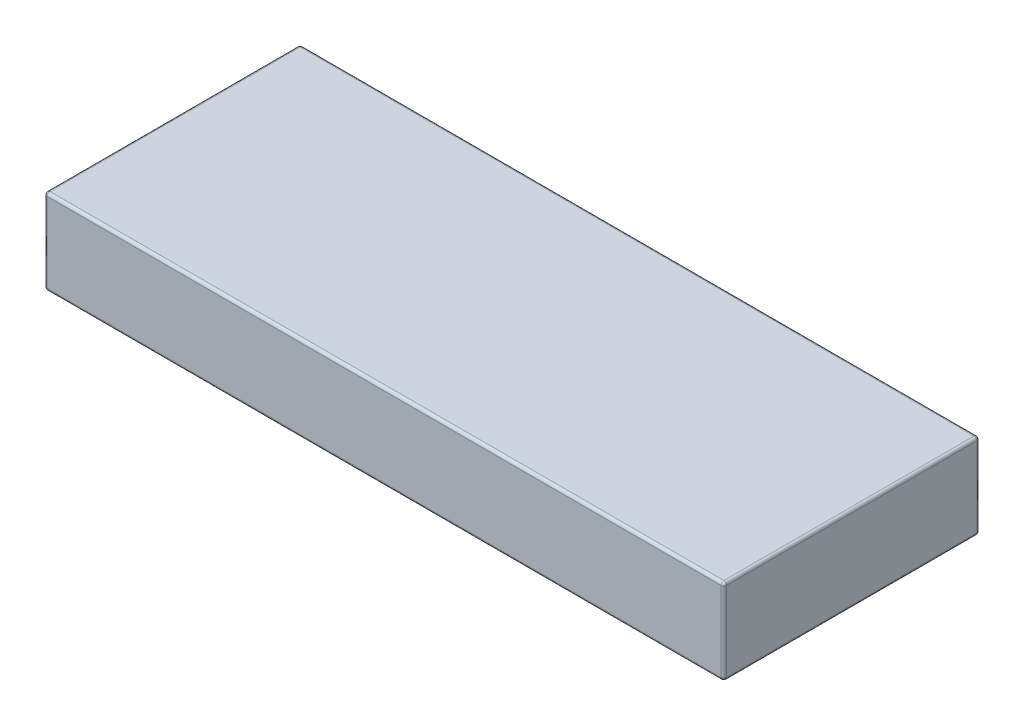
ISO-10303-21;
HEADER;
FILE_DESCRIPTION(('STEP AP214'),'2;1');
FILE_NAME('part.step','',(''),(''),'','','');
FILE_SCHEMA(('AUTOMOTIVE_DESIGN { 1 0 10303 214 1 1 1 1 }'));
ENDSEC;
DATA;
#1=APPLICATION_CONTEXT('core data for automotive mechanical design processes');
#2=APPLICATION_PROTOCOL_DEFINITION('international standard','automotive_design',2000,#1);
#3=PRODUCT_CONTEXT('',#1,'mechanical');
#4=PRODUCT('Part','Part','',(#3));
#5=PRODUCT_RELATED_PRODUCT_CATEGORY('part','',(#4));
#6=PRODUCT_DEFINITION_FORMATION('','',#4);
#7=PRODUCT_DEFINITION_CONTEXT('part definition',#1,'design');
#8=PRODUCT_DEFINITION('design','',#6,#7);
#9=PRODUCT_DEFINITION_SHAPE('','',#8);
#10=(LENGTH_UNIT() NAMED_UNIT(*) SI_UNIT(.MILLI.,.METRE.));
#11=(NAMED_UNIT(*) PLANE_ANGLE_UNIT() SI_UNIT($,.RADIAN.));
#12=(NAMED_UNIT(*) SI_UNIT($,.STERADIAN.) SOLID_ANGLE_UNIT());
#13=UNCERTAINTY_MEASURE_WITH_UNIT(LENGTH_MEASURE(1.E-05),#10,'distance_accuracy_value','');
#14=(GEOMETRIC_REPRESENTATION_CONTEXT(3) GLOBAL_UNCERTAINTY_ASSIGNED_CONTEXT((#13)) GLOBAL_UNIT_ASSIGNED_CONTEXT((#10,
#11,#12)) REPRESENTATION_CONTEXT('',''));
#15=CARTESIAN_POINT('',(0.,0.,0.));
#16=DIRECTION('',(0.,0.,1.));
#17=DIRECTION('',(1.,0.,0.));
#18=AXIS2_PLACEMENT_3D('',#15,#16,#17);
#19=CARTESIAN_POINT('',(0.,3.81,0.));
#20=DIRECTION('',(1.,0.,0.));
#21=DIRECTION('',(0.,0.,-1.));
#22=AXIS2_PLACEMENT_3D('',#19,#20,#21);
#23=PLANE('',#22);
#24=DIRECTION('',(0.,0.,1.));
#25=VECTOR('',#24,1.);
#26=CARTESIAN_POINT('',(0.,3.683,0.));
#27=LINE('',#26,#25);
#28=CARTESIAN_POINT('',(0.,3.683,-0.127));
#29=VERTEX_POINT('',#28);
#30=CARTESIAN_POINT('',(0.,3.683,-11.303));
#31=VERTEX_POINT('',#30);
#32=EDGE_CURVE('E153',#29,#31,#27,.F.);
#33=ORIENTED_EDGE('',*,*,#32,.T.);
#34=DIRECTION('',(0.,-1.,0.));
#35=VECTOR('',#34,1.);
#36=CARTESIAN_POINT('',(0.,3.81,-11.303));
#37=LINE('',#36,#35);
#38=CARTESIAN_POINT('',(0.,0.127,-11.303));
#39=VERTEX_POINT('',#38);
#40=EDGE_CURVE('E156',#31,#39,#37,.T.);
#41=ORIENTED_EDGE('',*,*,#40,.T.);
#42=DIRECTION('',(0.,0.,1.));
#43=VECTOR('',#42,1.);
#44=CARTESIAN_POINT('',(0.,0.127,0.));
#45=LINE('',#44,#43);
#46=CARTESIAN_POINT('',(0.,0.127,-0.127));
#47=VERTEX_POINT('',#46);
#48=EDGE_CURVE('E130',#39,#47,#45,.T.);
#49=ORIENTED_EDGE('',*,*,#48,.T.);
#50=DIRECTION('',(0.,-1.,0.));
#51=VECTOR('',#50,1.);
#52=CARTESIAN_POINT('',(0.,3.81,-0.127));
#53=LINE('',#52,#51);
#54=EDGE_CURVE('E148',#47,#29,#53,.F.);
#55=ORIENTED_EDGE('',*,*,#54,.T.);
#56=EDGE_LOOP('',(#33,#41,#49,#55));
#57=FACE_BOUND('',#56,.T.);
#58=ADVANCED_FACE('F33',(#57),#23,.F.);
#59=CARTESIAN_POINT('',(0.,3.81,0.));
#60=DIRECTION('',(0.,0.,-1.));
#61=DIRECTION('',(-1.,0.,0.));
#62=AXIS2_PLACEMENT_3D('',#59,#60,#61);
#63=PLANE('',#62);
#64=DIRECTION('',(1.,0.,0.));
#65=VECTOR('',#64,1.);
#66=CARTESIAN_POINT('',(0.,3.683,0.));
#67=LINE('',#66,#65);
#68=CARTESIAN_POINT('',(30.226,3.683,0.));
#69=VERTEX_POINT('',#68);
#70=CARTESIAN_POINT('',(0.127,3.683,0.));
#71=VERTEX_POINT('',#70);
#72=EDGE_CURVE('E171',#69,#71,#67,.F.);
#73=ORIENTED_EDGE('',*,*,#72,.T.);
#74=DIRECTION('',(0.,-1.,0.));
#75=VECTOR('',#74,1.);
#76=CARTESIAN_POINT('',(0.127,3.81,0.));
#77=LINE('',#76,#75);
#78=CARTESIAN_POINT('',(0.127,0.127,0.));
#79=VERTEX_POINT('',#78);
#80=EDGE_CURVE('E176',#71,#79,#77,.T.);
#81=ORIENTED_EDGE('',*,*,#80,.T.);
#82=DIRECTION('',(1.,0.,0.));
#83=VECTOR('',#82,1.);
#84=CARTESIAN_POINT('',(30.353,0.127,0.));
#85=LINE('',#84,#83);
#86=CARTESIAN_POINT('',(30.226,0.127,0.));
#87=VERTEX_POINT('',#86);
#88=EDGE_CURVE('E173',#79,#87,#85,.T.);
#89=ORIENTED_EDGE('',*,*,#88,.T.);
#90=DIRECTION('',(0.,-1.,0.));
#91=VECTOR('',#90,1.);
#92=CARTESIAN_POINT('',(30.226,3.81,0.));
#93=LINE('',#92,#91);
#94=EDGE_CURVE('E169',#87,#69,#93,.F.);
#95=ORIENTED_EDGE('',*,*,#94,.T.);
#96=EDGE_LOOP('',(#73,#81,#89,#95));
#97=FACE_BOUND('',#96,.T.);
#98=ADVANCED_FACE('F323',(#97),#63,.F.);
#99=CARTESIAN_POINT('',(30.353,3.81,0.));
#100=DIRECTION('',(-1.,0.,0.));
#101=DIRECTION('',(0.,0.,1.));
#102=AXIS2_PLACEMENT_3D('',#99,#100,#101);
#103=PLANE('',#102);
#104=DIRECTION('',(0.,0.,-1.));
#105=VECTOR('',#104,1.);
#106=CARTESIAN_POINT('',(30.353,0.127,-11.43));
#107=LINE('',#106,#105);
#108=CARTESIAN_POINT('',(30.353,0.127,-0.127));
#109=VERTEX_POINT('',#108);
#110=CARTESIAN_POINT('',(30.353,0.127,-11.303));
#111=VERTEX_POINT('',#110);
#112=EDGE_CURVE('E182',#109,#111,#107,.T.);
#113=ORIENTED_EDGE('',*,*,#112,.T.);
#114=DIRECTION('',(0.,-1.,0.));
#115=VECTOR('',#114,1.);
#116=CARTESIAN_POINT('',(30.353,3.81,-11.303));
#117=LINE('',#116,#115);
#118=CARTESIAN_POINT('',(30.353,3.683,-11.303));
#119=VERTEX_POINT('',#118);
#120=EDGE_CURVE('E185',#111,#119,#117,.F.);
#121=ORIENTED_EDGE('',*,*,#120,.T.);
#122=DIRECTION('',(0.,0.,-1.));
#123=VECTOR('',#122,1.);
#124=CARTESIAN_POINT('',(30.353,3.683,0.));
#125=LINE('',#124,#123);
#126=CARTESIAN_POINT('',(30.353,3.683,-0.127));
#127=VERTEX_POINT('',#126);
#128=EDGE_CURVE('E180',#119,#127,#125,.F.);
#129=ORIENTED_EDGE('',*,*,#128,.T.);
#130=DIRECTION('',(0.,-1.,0.));
#131=VECTOR('',#130,1.);
#132=CARTESIAN_POINT('',(30.353,3.81,-0.127));
#133=LINE('',#132,#131);
#134=EDGE_CURVE('E178',#127,#109,#133,.T.);
#135=ORIENTED_EDGE('',*,*,#134,.T.);
#136=EDGE_LOOP('',(#113,#121,#129,#135));
#137=FACE_BOUND('',#136,.T.);
#138=ADVANCED_FACE('F293',(#137),#103,.F.);
#139=CARTESIAN_POINT('',(0.,3.81,-11.43));
#140=DIRECTION('',(0.,0.,1.));
#141=DIRECTION('',(1.,0.,0.));
#142=AXIS2_PLACEMENT_3D('',#139,#140,#141);
#143=PLANE('',#142);
#144=DIRECTION('',(-1.,0.,0.));
#145=VECTOR('',#144,1.);
#146=CARTESIAN_POINT('',(0.,0.127,-11.43));
#147=LINE('',#146,#145);
#148=CARTESIAN_POINT('',(30.226,0.127,-11.43));
#149=VERTEX_POINT('',#148);
#150=CARTESIAN_POINT('',(0.127,0.127,-11.43));
#151=VERTEX_POINT('',#150);
#152=EDGE_CURVE('E191',#149,#151,#147,.T.);
#153=ORIENTED_EDGE('',*,*,#152,.T.);
#154=DIRECTION('',(0.,-1.,0.));
#155=VECTOR('',#154,1.);
#156=CARTESIAN_POINT('',(0.127,3.81,-11.43));
#157=LINE('',#156,#155);
#158=CARTESIAN_POINT('',(0.127,3.683,-11.43));
#159=VERTEX_POINT('',#158);
#160=EDGE_CURVE('E194',#151,#159,#157,.F.);
#161=ORIENTED_EDGE('',*,*,#160,.T.);
#162=DIRECTION('',(-1.,0.,0.));
#163=VECTOR('',#162,1.);
#164=CARTESIAN_POINT('',(0.,3.683,-11.43));
#165=LINE('',#164,#163);
#166=CARTESIAN_POINT('',(30.226,3.683,-11.43));
#167=VERTEX_POINT('',#166);
#168=EDGE_CURVE('E189',#159,#167,#165,.F.);
#169=ORIENTED_EDGE('',*,*,#168,.T.);
#170=DIRECTION('',(0.,-1.,0.));
#171=VECTOR('',#170,1.);
#172=CARTESIAN_POINT('',(30.226,3.81,-11.43));
#173=LINE('',#172,#171);
#174=EDGE_CURVE('E187',#167,#149,#173,.T.);
#175=ORIENTED_EDGE('',*,*,#174,.T.);
#176=EDGE_LOOP('',(#153,#161,#169,#175));
#177=FACE_BOUND('',#176,.T.);
#178=ADVANCED_FACE('F269',(#177),#143,.F.);
#179=CARTESIAN_POINT('',(0.,3.81,0.));
#180=DIRECTION('',(0.,-1.,0.));
#181=DIRECTION('',(0.,0.,-1.));
#182=AXIS2_PLACEMENT_3D('',#179,#180,#181);
#183=PLANE('',#182);
#184=DIRECTION('',(-1.,0.,0.));
#185=VECTOR('',#184,1.);
#186=CARTESIAN_POINT('',(0.,3.81,-11.303));
#187=LINE('',#186,#185);
#188=CARTESIAN_POINT('',(30.226,3.81,-11.303));
#189=VERTEX_POINT('',#188);
#190=CARTESIAN_POINT('',(0.127,3.81,-11.303));
#191=VERTEX_POINT('',#190);
#192=EDGE_CURVE('E196',#189,#191,#187,.T.);
#193=ORIENTED_EDGE('',*,*,#192,.T.);
#194=DIRECTION('',(0.,0.,1.));
#195=VECTOR('',#194,1.);
#196=CARTESIAN_POINT('',(0.127,3.81,0.));
#197=LINE('',#196,#195);
#198=CARTESIAN_POINT('',(0.127,3.81,-0.127));
#199=VERTEX_POINT('',#198);
#200=EDGE_CURVE('E11',#191,#199,#197,.T.);
#201=ORIENTED_EDGE('',*,*,#200,.T.);
#202=DIRECTION('',(1.,0.,0.));
#203=VECTOR('',#202,1.);
#204=CARTESIAN_POINT('',(0.,3.81,-0.127));
#205=LINE('',#204,#203);
#206=CARTESIAN_POINT('',(30.226,3.81,-0.127));
#207=VERTEX_POINT('',#206);
#208=EDGE_CURVE('E42',#199,#207,#205,.T.);
#209=ORIENTED_EDGE('',*,*,#208,.T.);
#210=DIRECTION('',(0.,0.,-1.));
#211=VECTOR('',#210,1.);
#212=CARTESIAN_POINT('',(30.226,3.81,0.));
#213=LINE('',#212,#211);
#214=EDGE_CURVE('E198',#207,#189,#213,.T.);
#215=ORIENTED_EDGE('',*,*,#214,.T.);
#216=EDGE_LOOP('',(#193,#201,#209,#215));
#217=FACE_BOUND('',#216,.T.);
#218=ADVANCED_FACE('F277',(#217),#183,.F.);
#219=CARTESIAN_POINT('',(0.,0.,0.));
#220=DIRECTION('',(0.,-1.,0.));
#221=DIRECTION('',(0.,0.,-1.));
#222=AXIS2_PLACEMENT_3D('',#219,#220,#221);
#223=PLANE('',#222);
#224=DIRECTION('',(1.,0.,0.));
#225=VECTOR('',#224,1.);
#226=CARTESIAN_POINT('',(0.,0.,-0.127));
#227=LINE('',#226,#225);
#228=CARTESIAN_POINT('',(30.226,0.,-0.127));
#229=VERTEX_POINT('',#228);
#230=CARTESIAN_POINT('',(0.127,0.,-0.127));
#231=VERTEX_POINT('',#230);
#232=EDGE_CURVE('E166',#229,#231,#227,.F.);
#233=ORIENTED_EDGE('',*,*,#232,.T.);
#234=DIRECTION('',(0.,0.,1.));
#235=VECTOR('',#234,1.);
#236=CARTESIAN_POINT('',(0.127,0.,-11.43));
#237=LINE('',#236,#235);
#238=CARTESIAN_POINT('',(0.127,0.,-11.303));
#239=VERTEX_POINT('',#238);
#240=EDGE_CURVE('E132',#231,#239,#237,.F.);
#241=ORIENTED_EDGE('',*,*,#240,.T.);
#242=DIRECTION('',(-1.,0.,0.));
#243=VECTOR('',#242,1.);
#244=CARTESIAN_POINT('',(30.353,0.,-11.303));
#245=LINE('',#244,#243);
#246=CARTESIAN_POINT('',(30.226,0.,-11.303));
#247=VERTEX_POINT('',#246);
#248=EDGE_CURVE('E159',#239,#247,#245,.F.);
#249=ORIENTED_EDGE('',*,*,#248,.T.);
#250=DIRECTION('',(0.,0.,-1.));
#251=VECTOR('',#250,1.);
#252=CARTESIAN_POINT('',(30.226,0.,0.));
#253=LINE('',#252,#251);
#254=EDGE_CURVE('E164',#247,#229,#253,.F.);
#255=ORIENTED_EDGE('',*,*,#254,.T.);
#256=EDGE_LOOP('',(#233,#241,#249,#255));
#257=FACE_BOUND('',#256,.T.);
#258=ADVANCED_FACE('F356',(#257),#223,.T.);
#259=CARTESIAN_POINT('',(30.226,3.683,0.));
#260=DIRECTION('',(0.,0.,-1.));
#261=DIRECTION('',(-1.,0.,0.));
#262=AXIS2_PLACEMENT_3D('',#259,#260,#261);
#263=CYLINDRICAL_SURFACE('',#262,0.127);
#264=CARTESIAN_POINT('',(30.226,3.683,-11.303));
#265=DIRECTION('',(0.,0.,-1.));
#266=DIRECTION('',(-1.,0.,0.));
#267=AXIS2_PLACEMENT_3D('',#264,#265,#266);
#268=CIRCLE('',#267,0.127);
#269=EDGE_CURVE('E37',#189,#119,#268,.T.);
#270=ORIENTED_EDGE('',*,*,#269,.F.);
#271=ORIENTED_EDGE('',*,*,#214,.F.);
#272=CARTESIAN_POINT('',(30.226,3.683,-0.127));
#273=DIRECTION('',(0.,0.,1.));
#274=DIRECTION('',(0.,-1.,0.));
#275=AXIS2_PLACEMENT_3D('',#272,#273,#274);
#276=CIRCLE('',#275,0.127);
#277=EDGE_CURVE('E247',#127,#207,#276,.T.);
#278=ORIENTED_EDGE('',*,*,#277,.F.);
#279=ORIENTED_EDGE('',*,*,#128,.F.);
#280=EDGE_LOOP('',(#270,#271,#278,#279));
#281=FACE_BOUND('',#280,.T.);
#282=ADVANCED_FACE('F35',(#281),#263,.T.);
#283=CARTESIAN_POINT('',(30.226,3.683,-11.303));
#284=DIRECTION('',(0.,0.,1.));
#285=DIRECTION('',(1.,0.,0.));
#286=AXIS2_PLACEMENT_3D('',#283,#284,#285);
#287=SPHERICAL_SURFACE('',#286,0.127);
#288=CARTESIAN_POINT('',(30.226,3.683,-11.303));
#289=DIRECTION('',(1.,0.,0.));
#290=DIRECTION('',(0.,0.,-1.));
#291=AXIS2_PLACEMENT_3D('',#288,#289,#290);
#292=CIRCLE('',#291,0.127);
#293=EDGE_CURVE('E242',#189,#167,#292,.F.);
#294=ORIENTED_EDGE('',*,*,#293,.F.);
#295=ORIENTED_EDGE('',*,*,#269,.T.);
#296=CARTESIAN_POINT('',(30.226,3.683,-11.303));
#297=DIRECTION('',(0.,1.,0.));
#298=DIRECTION('',(0.,0.,1.));
#299=AXIS2_PLACEMENT_3D('',#296,#297,#298);
#300=CIRCLE('',#299,0.127);
#301=EDGE_CURVE('E245',#167,#119,#300,.F.);
#302=ORIENTED_EDGE('',*,*,#301,.F.);
#303=EDGE_LOOP('',(#294,#295,#302));
#304=FACE_BOUND('',#303,.T.);
#305=ADVANCED_FACE('F258',(#304),#287,.T.);
#306=CARTESIAN_POINT('',(30.226,3.683,-0.127));
#307=DIRECTION('',(0.,0.,1.));
#308=DIRECTION('',(1.,0.,0.));
#309=AXIS2_PLACEMENT_3D('',#306,#307,#308);
#310=SPHERICAL_SURFACE('',#309,0.127);
#311=CARTESIAN_POINT('',(30.226,3.683,-0.127));
#312=DIRECTION('',(0.,1.,0.));
#313=DIRECTION('',(0.,0.,1.));
#314=AXIS2_PLACEMENT_3D('',#311,#312,#313);
#315=CIRCLE('',#314,0.127);
#316=EDGE_CURVE('E236',#127,#69,#315,.F.);
#317=ORIENTED_EDGE('',*,*,#316,.F.);
#318=ORIENTED_EDGE('',*,*,#277,.T.);
#319=CARTESIAN_POINT('',(30.226,3.683,-0.127));
#320=DIRECTION('',(1.,0.,0.));
#321=DIRECTION('',(0.,0.,-1.));
#322=AXIS2_PLACEMENT_3D('',#319,#320,#321);
#323=CIRCLE('',#322,0.127);
#324=EDGE_CURVE('E239',#69,#207,#323,.F.);
#325=ORIENTED_EDGE('',*,*,#324,.F.);
#326=EDGE_LOOP('',(#317,#318,#325));
#327=FACE_BOUND('',#326,.T.);
#328=ADVANCED_FACE('F285',(#327),#310,.T.);
#329=CARTESIAN_POINT('',(30.226,3.81,-11.303));
#330=DIRECTION('',(0.,-1.,0.));
#331=DIRECTION('',(0.,0.,-1.));
#332=AXIS2_PLACEMENT_3D('',#329,#330,#331);
#333=CYLINDRICAL_SURFACE('',#332,0.127);
#334=ORIENTED_EDGE('',*,*,#301,.T.);
#335=ORIENTED_EDGE('',*,*,#120,.F.);
#336=CARTESIAN_POINT('',(30.226,0.127,-11.303));
#337=DIRECTION('',(0.,-1.,0.));
#338=DIRECTION('',(0.,0.,-1.));
#339=AXIS2_PLACEMENT_3D('',#336,#337,#338);
#340=CIRCLE('',#339,0.127);
#341=EDGE_CURVE('E231',#149,#111,#340,.T.);
#342=ORIENTED_EDGE('',*,*,#341,.F.);
#343=ORIENTED_EDGE('',*,*,#174,.F.);
#344=EDGE_LOOP('',(#334,#335,#342,#343));
#345=FACE_BOUND('',#344,.T.);
#346=ADVANCED_FACE('F265',(#345),#333,.T.);
#347=CARTESIAN_POINT('',(0.,3.683,-11.303));
#348=DIRECTION('',(-1.,0.,0.));
#349=DIRECTION('',(0.,0.,1.));
#350=AXIS2_PLACEMENT_3D('',#347,#348,#349);
#351=CYLINDRICAL_SURFACE('',#350,0.127);
#352=ORIENTED_EDGE('',*,*,#293,.T.);
#353=ORIENTED_EDGE('',*,*,#168,.F.);
#354=CARTESIAN_POINT('',(0.127,3.683,-11.303));
#355=DIRECTION('',(-1.,0.,0.));
#356=DIRECTION('',(0.,0.,1.));
#357=AXIS2_PLACEMENT_3D('',#354,#355,#356);
#358=CIRCLE('',#357,0.127);
#359=EDGE_CURVE('E228',#191,#159,#358,.T.);
#360=ORIENTED_EDGE('',*,*,#359,.F.);
#361=ORIENTED_EDGE('',*,*,#192,.F.);
#362=EDGE_LOOP('',(#352,#353,#360,#361));
#363=FACE_BOUND('',#362,.T.);
#364=ADVANCED_FACE('F275',(#363),#351,.T.);
#365=CARTESIAN_POINT('',(0.127,3.683,0.));
#366=DIRECTION('',(0.,0.,1.));
#367=DIRECTION('',(1.,0.,0.));
#368=AXIS2_PLACEMENT_3D('',#365,#366,#367);
#369=CYLINDRICAL_SURFACE('',#368,0.127);
#370=CARTESIAN_POINT('',(0.127,3.683,-0.127));
#371=DIRECTION('',(0.,0.,1.));
#372=DIRECTION('',(1.,0.,0.));
#373=AXIS2_PLACEMENT_3D('',#370,#371,#372);
#374=CIRCLE('',#373,0.127);
#375=EDGE_CURVE('E223',#199,#29,#374,.T.);
#376=ORIENTED_EDGE('',*,*,#375,.F.);
#377=ORIENTED_EDGE('',*,*,#200,.F.);
#378=CARTESIAN_POINT('',(0.127,3.683,-11.303));
#379=DIRECTION('',(0.,0.,-1.));
#380=DIRECTION('',(0.,1.,0.));
#381=AXIS2_PLACEMENT_3D('',#378,#379,#380);
#382=CIRCLE('',#381,0.127);
#383=EDGE_CURVE('E225',#31,#191,#382,.T.);
#384=ORIENTED_EDGE('',*,*,#383,.F.);
#385=ORIENTED_EDGE('',*,*,#32,.F.);
#386=EDGE_LOOP('',(#376,#377,#384,#385));
#387=FACE_BOUND('',#386,.T.);
#388=ADVANCED_FACE('F280',(#387),#369,.T.);
#389=CARTESIAN_POINT('',(0.,3.683,-0.127));
#390=DIRECTION('',(1.,0.,0.));
#391=DIRECTION('',(0.,0.,-1.));
#392=AXIS2_PLACEMENT_3D('',#389,#390,#391);
#393=CYLINDRICAL_SURFACE('',#392,0.127);
#394=ORIENTED_EDGE('',*,*,#324,.T.);
#395=ORIENTED_EDGE('',*,*,#208,.F.);
#396=CARTESIAN_POINT('',(0.127,3.683,-0.127));
#397=DIRECTION('',(-1.,0.,0.));
#398=DIRECTION('',(0.,-1.,0.));
#399=AXIS2_PLACEMENT_3D('',#396,#397,#398);
#400=CIRCLE('',#399,0.127);
#401=EDGE_CURVE('E50',#71,#199,#400,.T.);
#402=ORIENTED_EDGE('',*,*,#401,.F.);
#403=ORIENTED_EDGE('',*,*,#72,.F.);
#404=EDGE_LOOP('',(#394,#395,#402,#403));
#405=FACE_BOUND('',#404,.T.);
#406=ADVANCED_FACE('F283',(#405),#393,.T.);
#407=CARTESIAN_POINT('',(30.226,3.81,-0.127));
#408=DIRECTION('',(0.,-1.,0.));
#409=DIRECTION('',(0.,0.,-1.));
#410=AXIS2_PLACEMENT_3D('',#407,#408,#409);
#411=CYLINDRICAL_SURFACE('',#410,0.127);
#412=ORIENTED_EDGE('',*,*,#316,.T.);
#413=ORIENTED_EDGE('',*,*,#94,.F.);
#414=CARTESIAN_POINT('',(30.226,0.127,-0.127));
#415=DIRECTION('',(0.,-1.,0.));
#416=DIRECTION('',(0.,0.,-1.));
#417=AXIS2_PLACEMENT_3D('',#414,#415,#416);
#418=CIRCLE('',#417,0.127);
#419=EDGE_CURVE('E219',#109,#87,#418,.T.);
#420=ORIENTED_EDGE('',*,*,#419,.F.);
#421=ORIENTED_EDGE('',*,*,#134,.F.);
#422=EDGE_LOOP('',(#412,#413,#420,#421));
#423=FACE_BOUND('',#422,.T.);
#424=ADVANCED_FACE('F290',(#423),#411,.T.);
#425=CARTESIAN_POINT('',(30.226,0.127,0.));
#426=DIRECTION('',(0.,0.,1.));
#427=DIRECTION('',(1.,0.,0.));
#428=AXIS2_PLACEMENT_3D('',#425,#426,#427);
#429=CYLINDRICAL_SURFACE('',#428,0.127);
#430=CARTESIAN_POINT('',(30.226,0.127,-11.303));
#431=DIRECTION('',(0.,0.,-1.));
#432=DIRECTION('',(-1.,0.,0.));
#433=AXIS2_PLACEMENT_3D('',#430,#431,#432);
#434=CIRCLE('',#433,0.127);
#435=EDGE_CURVE('E233',#111,#247,#434,.T.);
#436=ORIENTED_EDGE('',*,*,#435,.F.);
#437=ORIENTED_EDGE('',*,*,#112,.F.);
#438=CARTESIAN_POINT('',(30.226,0.127,-0.127));
#439=DIRECTION('',(0.,0.,1.));
#440=DIRECTION('',(1.,0.,0.));
#441=AXIS2_PLACEMENT_3D('',#438,#439,#440);
#442=CIRCLE('',#441,0.127);
#443=EDGE_CURVE('E216',#229,#109,#442,.T.);
#444=ORIENTED_EDGE('',*,*,#443,.F.);
#445=ORIENTED_EDGE('',*,*,#254,.F.);
#446=EDGE_LOOP('',(#436,#437,#444,#445));
#447=FACE_BOUND('',#446,.T.);
#448=ADVANCED_FACE('F297',(#447),#429,.T.);
#449=CARTESIAN_POINT('',(30.226,0.127,-11.303));
#450=DIRECTION('',(0.,0.,1.));
#451=DIRECTION('',(1.,0.,0.));
#452=AXIS2_PLACEMENT_3D('',#449,#450,#451);
#453=SPHERICAL_SURFACE('',#452,0.127);
#454=ORIENTED_EDGE('',*,*,#341,.T.);
#455=ORIENTED_EDGE('',*,*,#435,.T.);
#456=CARTESIAN_POINT('',(30.226,0.127,-11.303));
#457=DIRECTION('',(1.,0.,0.));
#458=DIRECTION('',(0.,0.,-1.));
#459=AXIS2_PLACEMENT_3D('',#456,#457,#458);
#460=CIRCLE('',#459,0.127);
#461=EDGE_CURVE('E213',#149,#247,#460,.F.);
#462=ORIENTED_EDGE('',*,*,#461,.F.);
#463=EDGE_LOOP('',(#454,#455,#462));
#464=FACE_BOUND('',#463,.T.);
#465=ADVANCED_FACE('F301',(#464),#453,.T.);
#466=CARTESIAN_POINT('',(0.127,3.683,-11.303));
#467=DIRECTION('',(0.,0.,1.));
#468=DIRECTION('',(1.,0.,0.));
#469=AXIS2_PLACEMENT_3D('',#466,#467,#468);
#470=SPHERICAL_SURFACE('',#469,0.127);
#471=ORIENTED_EDGE('',*,*,#383,.T.);
#472=ORIENTED_EDGE('',*,*,#359,.T.);
#473=CARTESIAN_POINT('',(0.127,3.683,-11.303));
#474=DIRECTION('',(0.,1.,0.));
#475=DIRECTION('',(0.,0.,1.));
#476=AXIS2_PLACEMENT_3D('',#473,#474,#475);
#477=CIRCLE('',#476,0.127);
#478=EDGE_CURVE('E210',#31,#159,#477,.F.);
#479=ORIENTED_EDGE('',*,*,#478,.F.);
#480=EDGE_LOOP('',(#471,#472,#479));
#481=FACE_BOUND('',#480,.T.);
#482=ADVANCED_FACE('F311',(#481),#470,.T.);
#483=CARTESIAN_POINT('',(0.127,3.683,-0.127));
#484=DIRECTION('',(0.,0.,1.));
#485=DIRECTION('',(1.,0.,0.));
#486=AXIS2_PLACEMENT_3D('',#483,#484,#485);
#487=SPHERICAL_SURFACE('',#486,0.127);
#488=ORIENTED_EDGE('',*,*,#401,.T.);
#489=ORIENTED_EDGE('',*,*,#375,.T.);
#490=CARTESIAN_POINT('',(0.127,3.683,-0.127));
#491=DIRECTION('',(0.,1.,0.));
#492=DIRECTION('',(0.,0.,1.));
#493=AXIS2_PLACEMENT_3D('',#490,#491,#492);
#494=CIRCLE('',#493,0.127);
#495=EDGE_CURVE('E150',#71,#29,#494,.F.);
#496=ORIENTED_EDGE('',*,*,#495,.F.);
#497=EDGE_LOOP('',(#488,#489,#496));
#498=FACE_BOUND('',#497,.T.);
#499=ADVANCED_FACE('F313',(#498),#487,.T.);
#500=CARTESIAN_POINT('',(30.226,0.127,-0.127));
#501=DIRECTION('',(0.,0.,1.));
#502=DIRECTION('',(1.,0.,0.));
#503=AXIS2_PLACEMENT_3D('',#500,#501,#502);
#504=SPHERICAL_SURFACE('',#503,0.127);
#505=ORIENTED_EDGE('',*,*,#443,.T.);
#506=ORIENTED_EDGE('',*,*,#419,.T.);
#507=CARTESIAN_POINT('',(30.226,0.127,-0.127));
#508=DIRECTION('',(1.,0.,0.));
#509=DIRECTION('',(0.,0.,-1.));
#510=AXIS2_PLACEMENT_3D('',#507,#508,#509);
#511=CIRCLE('',#510,0.127);
#512=EDGE_CURVE('E207',#229,#87,#511,.F.);
#513=ORIENTED_EDGE('',*,*,#512,.F.);
#514=EDGE_LOOP('',(#505,#506,#513));
#515=FACE_BOUND('',#514,.T.);
#516=ADVANCED_FACE('F319',(#515),#504,.T.);
#517=CARTESIAN_POINT('',(0.,0.127,-11.303));
#518=DIRECTION('',(1.,0.,0.));
#519=DIRECTION('',(0.,0.,-1.));
#520=AXIS2_PLACEMENT_3D('',#517,#518,#519);
#521=CYLINDRICAL_SURFACE('',#520,0.127);
#522=ORIENTED_EDGE('',*,*,#461,.T.);
#523=ORIENTED_EDGE('',*,*,#248,.F.);
#524=CARTESIAN_POINT('',(0.127,0.127,-11.303));
#525=DIRECTION('',(-1.,0.,0.));
#526=DIRECTION('',(0.,0.,1.));
#527=AXIS2_PLACEMENT_3D('',#524,#525,#526);
#528=CIRCLE('',#527,0.127);
#529=EDGE_CURVE('E204',#151,#239,#528,.T.);
#530=ORIENTED_EDGE('',*,*,#529,.F.);
#531=ORIENTED_EDGE('',*,*,#152,.F.);
#532=EDGE_LOOP('',(#522,#523,#530,#531));
#533=FACE_BOUND('',#532,.T.);
#534=ADVANCED_FACE('F304',(#533),#521,.T.);
#535=CARTESIAN_POINT('',(0.127,3.81,-11.303));
#536=DIRECTION('',(0.,-1.,0.));
#537=DIRECTION('',(0.,0.,-1.));
#538=AXIS2_PLACEMENT_3D('',#535,#536,#537);
#539=CYLINDRICAL_SURFACE('',#538,0.127);
#540=ORIENTED_EDGE('',*,*,#478,.T.);
#541=ORIENTED_EDGE('',*,*,#160,.F.);
#542=CARTESIAN_POINT('',(0.127,0.127,-11.303));
#543=DIRECTION('',(0.,-1.,0.));
#544=DIRECTION('',(0.,0.,-1.));
#545=AXIS2_PLACEMENT_3D('',#542,#543,#544);
#546=CIRCLE('',#545,0.127);
#547=EDGE_CURVE('E145',#39,#151,#546,.T.);
#548=ORIENTED_EDGE('',*,*,#547,.F.);
#549=ORIENTED_EDGE('',*,*,#40,.F.);
#550=EDGE_LOOP('',(#540,#541,#548,#549));
#551=FACE_BOUND('',#550,.T.);
#552=ADVANCED_FACE('F309',(#551),#539,.T.);
#553=CARTESIAN_POINT('',(0.127,3.81,-0.127));
#554=DIRECTION('',(0.,-1.,0.));
#555=DIRECTION('',(0.,0.,-1.));
#556=AXIS2_PLACEMENT_3D('',#553,#554,#555);
#557=CYLINDRICAL_SURFACE('',#556,0.127);
#558=ORIENTED_EDGE('',*,*,#495,.T.);
#559=ORIENTED_EDGE('',*,*,#54,.F.);
#560=CARTESIAN_POINT('',(0.127,0.127,-0.127));
#561=DIRECTION('',(0.,-1.,0.));
#562=DIRECTION('',(0.,0.,-1.));
#563=AXIS2_PLACEMENT_3D('',#560,#561,#562);
#564=CIRCLE('',#563,0.127);
#565=EDGE_CURVE('E138',#79,#47,#564,.T.);
#566=ORIENTED_EDGE('',*,*,#565,.F.);
#567=ORIENTED_EDGE('',*,*,#80,.F.);
#568=EDGE_LOOP('',(#558,#559,#566,#567));
#569=FACE_BOUND('',#568,.T.);
#570=ADVANCED_FACE('F149',(#569),#557,.T.);
#571=CARTESIAN_POINT('',(0.,0.127,-0.127));
#572=DIRECTION('',(-1.,0.,0.));
#573=DIRECTION('',(0.,0.,1.));
#574=AXIS2_PLACEMENT_3D('',#571,#572,#573);
#575=CYLINDRICAL_SURFACE('',#574,0.127);
#576=ORIENTED_EDGE('',*,*,#512,.T.);
#577=ORIENTED_EDGE('',*,*,#88,.F.);
#578=CARTESIAN_POINT('',(0.127,0.127,-0.127));
#579=DIRECTION('',(-1.,0.,0.));
#580=DIRECTION('',(0.,0.,1.));
#581=AXIS2_PLACEMENT_3D('',#578,#579,#580);
#582=CIRCLE('',#581,0.127);
#583=EDGE_CURVE('E142',#231,#79,#582,.T.);
#584=ORIENTED_EDGE('',*,*,#583,.F.);
#585=ORIENTED_EDGE('',*,*,#232,.F.);
#586=EDGE_LOOP('',(#576,#577,#584,#585));
#587=FACE_BOUND('',#586,.T.);
#588=ADVANCED_FACE('F339',(#587),#575,.T.);
#589=CARTESIAN_POINT('',(0.127,0.127,-11.303));
#590=DIRECTION('',(0.,0.,1.));
#591=DIRECTION('',(1.,0.,0.));
#592=AXIS2_PLACEMENT_3D('',#589,#590,#591);
#593=SPHERICAL_SURFACE('',#592,0.127);
#594=ORIENTED_EDGE('',*,*,#547,.T.);
#595=ORIENTED_EDGE('',*,*,#529,.T.);
#596=CARTESIAN_POINT('',(0.127,0.127,-11.303));
#597=DIRECTION('',(0.,0.,-1.));
#598=DIRECTION('',(-1.,0.,0.));
#599=AXIS2_PLACEMENT_3D('',#596,#597,#598);
#600=CIRCLE('',#599,0.127);
#601=EDGE_CURVE('E135',#39,#239,#600,.F.);
#602=ORIENTED_EDGE('',*,*,#601,.F.);
#603=EDGE_LOOP('',(#594,#595,#602));
#604=FACE_BOUND('',#603,.T.);
#605=ADVANCED_FACE('F336',(#604),#593,.T.);
#606=CARTESIAN_POINT('',(0.127,0.127,-0.127));
#607=DIRECTION('',(0.,0.,1.));
#608=DIRECTION('',(1.,0.,0.));
#609=AXIS2_PLACEMENT_3D('',#606,#607,#608);
#610=SPHERICAL_SURFACE('',#609,0.127);
#611=ORIENTED_EDGE('',*,*,#583,.T.);
#612=ORIENTED_EDGE('',*,*,#565,.T.);
#613=CARTESIAN_POINT('',(0.127,0.127,-0.127));
#614=DIRECTION('',(0.,0.,1.));
#615=DIRECTION('',(1.,0.,0.));
#616=AXIS2_PLACEMENT_3D('',#613,#614,#615);
#617=CIRCLE('',#616,0.127);
#618=EDGE_CURVE('E126',#231,#47,#617,.F.);
#619=ORIENTED_EDGE('',*,*,#618,.F.);
#620=EDGE_LOOP('',(#611,#612,#619));
#621=FACE_BOUND('',#620,.T.);
#622=ADVANCED_FACE('F140',(#621),#610,.T.);
#623=CARTESIAN_POINT('',(0.127,0.127,0.));
#624=DIRECTION('',(0.,0.,-1.));
#625=DIRECTION('',(-1.,0.,0.));
#626=AXIS2_PLACEMENT_3D('',#623,#624,#625);
#627=CYLINDRICAL_SURFACE('',#626,0.127);
#628=ORIENTED_EDGE('',*,*,#601,.T.);
#629=ORIENTED_EDGE('',*,*,#240,.F.);
#630=ORIENTED_EDGE('',*,*,#618,.T.);
#631=ORIENTED_EDGE('',*,*,#48,.F.);
#632=EDGE_LOOP('',(#628,#629,#630,#631));
#633=FACE_BOUND('',#632,.T.);
#634=ADVANCED_FACE('F128',(#633),#627,.T.);
#635=CLOSED_SHELL('',(#58,#98,#138,#178,#218,#258,#282,#305,#328,#346,#364,#388,#406,#424,#448,
#465,#482,#499,#516,#534,#552,#570,#588,#605,#622,#634));
#636=MANIFOLD_SOLID_BREP('B2',#635);
#637=ADVANCED_BREP_SHAPE_REPRESENTATION('',(#18,#636),#14);
#638=SHAPE_DEFINITION_REPRESENTATION(#9,#637);
ENDSEC;
END-ISO-10303-21;
